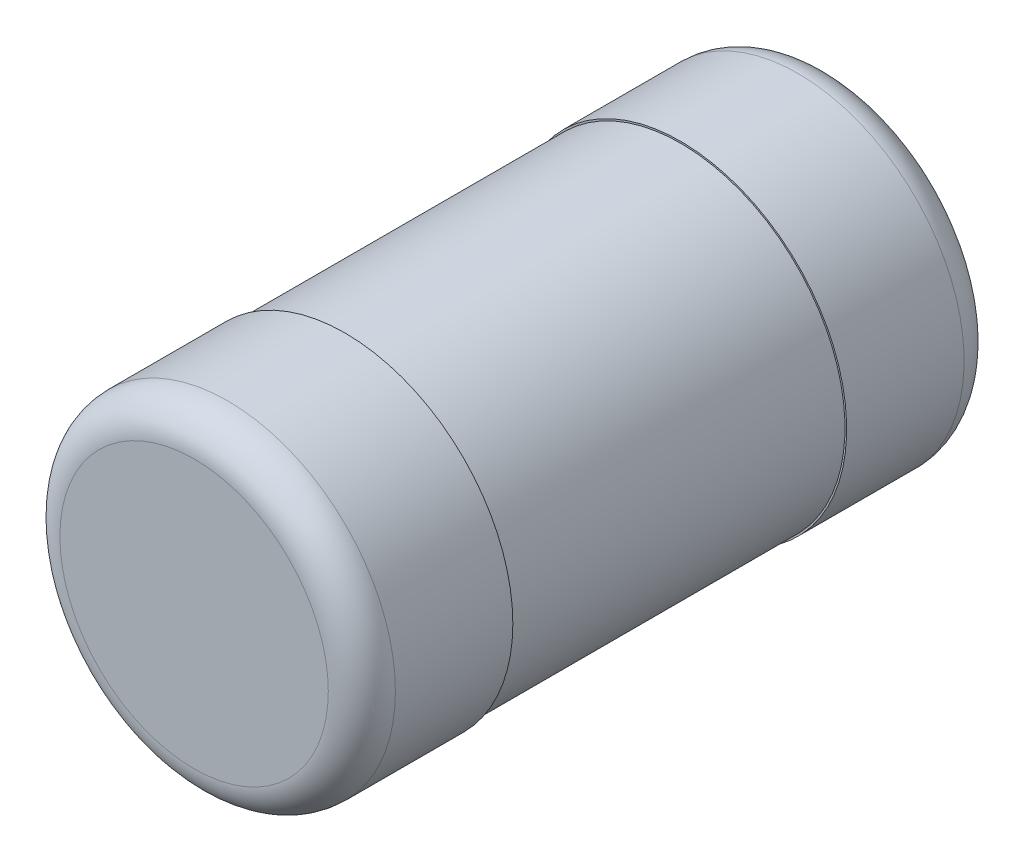
ISO-10303-21;
HEADER;
FILE_DESCRIPTION(('STEP AP214'),'2;1');
FILE_NAME('part.step','',(''),(''),'','','');
FILE_SCHEMA(('AUTOMOTIVE_DESIGN { 1 0 10303 214 1 1 1 1 }'));
ENDSEC;
DATA;
#1=APPLICATION_CONTEXT('core data for automotive mechanical design processes');
#2=APPLICATION_PROTOCOL_DEFINITION('international standard','automotive_design',2000,#1);
#3=PRODUCT_CONTEXT('',#1,'mechanical');
#4=PRODUCT('Part','Part','',(#3));
#5=PRODUCT_RELATED_PRODUCT_CATEGORY('part','',(#4));
#6=PRODUCT_DEFINITION_FORMATION('','',#4);
#7=PRODUCT_DEFINITION_CONTEXT('part definition',#1,'design');
#8=PRODUCT_DEFINITION('design','',#6,#7);
#9=PRODUCT_DEFINITION_SHAPE('','',#8);
#10=(LENGTH_UNIT() NAMED_UNIT(*) SI_UNIT(.MILLI.,.METRE.));
#11=(NAMED_UNIT(*) PLANE_ANGLE_UNIT() SI_UNIT($,.RADIAN.));
#12=(NAMED_UNIT(*) SI_UNIT($,.STERADIAN.) SOLID_ANGLE_UNIT());
#13=UNCERTAINTY_MEASURE_WITH_UNIT(LENGTH_MEASURE(1.E-05),#10,'distance_accuracy_value','');
#14=(GEOMETRIC_REPRESENTATION_CONTEXT(3) GLOBAL_UNCERTAINTY_ASSIGNED_CONTEXT((#13)) GLOBAL_UNIT_ASSIGNED_CONTEXT((#10,
#11,#12)) REPRESENTATION_CONTEXT('',''));
#15=CARTESIAN_POINT('',(0.,0.,0.));
#16=DIRECTION('',(0.,0.,1.));
#17=DIRECTION('',(1.,0.,0.));
#18=AXIS2_PLACEMENT_3D('',#15,#16,#17);
#19=CARTESIAN_POINT('',(0.,0.,5.));
#20=DIRECTION('',(0.,0.,-1.));
#21=DIRECTION('',(-1.,0.,0.));
#22=AXIS2_PLACEMENT_3D('',#19,#20,#21);
#23=CYLINDRICAL_SURFACE('',#22,2.45);
#24=CARTESIAN_POINT('',(0.,0.,5.));
#25=DIRECTION('',(0.,0.,1.));
#26=DIRECTION('',(1.,0.,0.));
#27=AXIS2_PLACEMENT_3D('',#24,#25,#26);
#28=CIRCLE('',#27,2.45);
#29=CARTESIAN_POINT('',(2.45,0.,5.));
#30=VERTEX_POINT('',#29);
#31=EDGE_CURVE('E51',#30,#30,#28,.T.);
#32=ORIENTED_EDGE('',*,*,#31,.F.);
#33=EDGE_LOOP('',(#32));
#34=FACE_BOUND('',#33,.T.);
#35=CARTESIAN_POINT('',(0.,0.,0.));
#36=DIRECTION('',(0.,0.,-1.));
#37=DIRECTION('',(-1.,0.,0.));
#38=AXIS2_PLACEMENT_3D('',#35,#36,#37);
#39=CIRCLE('',#38,2.45);
#40=CARTESIAN_POINT('',(-2.45,0.,0.));
#41=VERTEX_POINT('',#40);
#42=EDGE_CURVE('E57',#41,#41,#39,.T.);
#43=ORIENTED_EDGE('',*,*,#42,.F.);
#44=EDGE_LOOP('',(#43));
#45=FACE_BOUND('',#44,.T.);
#46=ADVANCED_FACE('F31',(#34,#45),#23,.T.);
#47=CARTESIAN_POINT('',(0.,0.,7.25));
#48=DIRECTION('',(0.,0.,-1.));
#49=DIRECTION('',(-1.,0.,0.));
#50=AXIS2_PLACEMENT_3D('',#47,#48,#49);
#51=CYLINDRICAL_SURFACE('',#50,2.5);
#52=CARTESIAN_POINT('',(0.,0.,6.75));
#53=DIRECTION('',(0.,0.,1.));
#54=DIRECTION('',(1.,0.,0.));
#55=AXIS2_PLACEMENT_3D('',#52,#53,#54);
#56=CIRCLE('',#55,2.5);
#57=CARTESIAN_POINT('',(2.5,0.,6.75));
#58=VERTEX_POINT('',#57);
#59=EDGE_CURVE('E42',#58,#58,#56,.F.);
#60=ORIENTED_EDGE('',*,*,#59,.T.);
#61=EDGE_LOOP('',(#60));
#62=FACE_BOUND('',#61,.T.);
#63=CARTESIAN_POINT('',(0.,0.,5.));
#64=DIRECTION('',(0.,0.,1.));
#65=DIRECTION('',(1.,0.,0.));
#66=AXIS2_PLACEMENT_3D('',#63,#64,#65);
#67=CIRCLE('',#66,2.5);
#68=CARTESIAN_POINT('',(2.5,0.,5.));
#69=VERTEX_POINT('',#68);
#70=EDGE_CURVE('E54',#69,#69,#67,.T.);
#71=ORIENTED_EDGE('',*,*,#70,.T.);
#72=EDGE_LOOP('',(#71));
#73=FACE_BOUND('',#72,.T.);
#74=ADVANCED_FACE('F80',(#62,#73),#51,.T.);
#75=CARTESIAN_POINT('',(0.,0.,7.25));
#76=DIRECTION('',(0.,0.,1.));
#77=DIRECTION('',(1.,0.,0.));
#78=AXIS2_PLACEMENT_3D('',#75,#76,#77);
#79=PLANE('',#78);
#80=CARTESIAN_POINT('',(0.,0.,7.25));
#81=DIRECTION('',(0.,0.,1.));
#82=DIRECTION('',(1.,0.,0.));
#83=AXIS2_PLACEMENT_3D('',#80,#81,#82);
#84=CIRCLE('',#83,2.);
#85=CARTESIAN_POINT('',(2.,0.,7.25));
#86=VERTEX_POINT('',#85);
#87=EDGE_CURVE('E46',#86,#86,#84,.T.);
#88=ORIENTED_EDGE('',*,*,#87,.T.);
#89=EDGE_LOOP('',(#88));
#90=FACE_BOUND('',#89,.T.);
#91=ADVANCED_FACE('F86',(#90),#79,.T.);
#92=CARTESIAN_POINT('',(0.,0.,5.));
#93=DIRECTION('',(0.,0.,1.));
#94=DIRECTION('',(1.,0.,0.));
#95=AXIS2_PLACEMENT_3D('',#92,#93,#94);
#96=PLANE('',#95);
#97=ORIENTED_EDGE('',*,*,#31,.T.);
#98=EDGE_LOOP('',(#97));
#99=FACE_BOUND('',#98,.T.);
#100=ORIENTED_EDGE('',*,*,#70,.F.);
#101=EDGE_LOOP('',(#100));
#102=FACE_BOUND('',#101,.T.);
#103=ADVANCED_FACE('F92',(#99,#102),#96,.F.);
#104=CARTESIAN_POINT('',(0.,0.,-2.25));
#105=DIRECTION('',(0.,0.,1.));
#106=DIRECTION('',(1.,0.,0.));
#107=AXIS2_PLACEMENT_3D('',#104,#105,#106);
#108=CYLINDRICAL_SURFACE('',#107,2.475);
#109=CARTESIAN_POINT('',(0.,0.,-1.75));
#110=DIRECTION('',(0.,0.,-1.));
#111=DIRECTION('',(-1.,0.,0.));
#112=AXIS2_PLACEMENT_3D('',#109,#110,#111);
#113=CIRCLE('',#112,2.475);
#114=CARTESIAN_POINT('',(-2.475,0.,-1.75));
#115=VERTEX_POINT('',#114);
#116=EDGE_CURVE('E10',#115,#115,#113,.F.);
#117=ORIENTED_EDGE('',*,*,#116,.T.);
#118=EDGE_LOOP('',(#117));
#119=FACE_BOUND('',#118,.T.);
#120=CARTESIAN_POINT('',(0.,0.,0.));
#121=DIRECTION('',(0.,0.,-1.));
#122=DIRECTION('',(-1.,0.,0.));
#123=AXIS2_PLACEMENT_3D('',#120,#121,#122);
#124=CIRCLE('',#123,2.475);
#125=CARTESIAN_POINT('',(-2.475,0.,0.));
#126=VERTEX_POINT('',#125);
#127=EDGE_CURVE('E60',#126,#126,#124,.T.);
#128=ORIENTED_EDGE('',*,*,#127,.T.);
#129=EDGE_LOOP('',(#128));
#130=FACE_BOUND('',#129,.T.);
#131=ADVANCED_FACE('F64',(#119,#130),#108,.T.);
#132=CARTESIAN_POINT('',(0.,0.,-2.25));
#133=DIRECTION('',(0.,0.,-1.));
#134=DIRECTION('',(-1.,0.,0.));
#135=AXIS2_PLACEMENT_3D('',#132,#133,#134);
#136=PLANE('',#135);
#137=CARTESIAN_POINT('',(0.,0.,-2.25));
#138=DIRECTION('',(0.,0.,-1.));
#139=DIRECTION('',(-1.,0.,0.));
#140=AXIS2_PLACEMENT_3D('',#137,#138,#139);
#141=CIRCLE('',#140,1.975);
#142=CARTESIAN_POINT('',(-1.975,0.,-2.25));
#143=VERTEX_POINT('',#142);
#144=EDGE_CURVE('E38',#143,#143,#141,.T.);
#145=ORIENTED_EDGE('',*,*,#144,.T.);
#146=EDGE_LOOP('',(#145));
#147=FACE_BOUND('',#146,.T.);
#148=ADVANCED_FACE('F69',(#147),#136,.T.);
#149=CARTESIAN_POINT('',(0.,0.,0.));
#150=DIRECTION('',(0.,0.,-1.));
#151=DIRECTION('',(-1.,0.,0.));
#152=AXIS2_PLACEMENT_3D('',#149,#150,#151);
#153=PLANE('',#152);
#154=ORIENTED_EDGE('',*,*,#42,.T.);
#155=EDGE_LOOP('',(#154));
#156=FACE_BOUND('',#155,.T.);
#157=ORIENTED_EDGE('',*,*,#127,.F.);
#158=EDGE_LOOP('',(#157));
#159=FACE_BOUND('',#158,.T.);
#160=ADVANCED_FACE('F66',(#156,#159),#153,.F.);
#161=CARTESIAN_POINT('',(0.,0.,6.75));
#162=DIRECTION('',(0.,0.,1.));
#163=DIRECTION('',(1.,0.,0.));
#164=AXIS2_PLACEMENT_3D('',#161,#162,#163);
#165=TOROIDAL_SURFACE('',#164,2.,0.5);
#166=ORIENTED_EDGE('',*,*,#59,.F.);
#167=EDGE_LOOP('',(#166));
#168=FACE_BOUND('',#167,.T.);
#169=ORIENTED_EDGE('',*,*,#87,.F.);
#170=EDGE_LOOP('',(#169));
#171=FACE_BOUND('',#170,.T.);
#172=ADVANCED_FACE('F68',(#168,#171),#165,.T.);
#173=CARTESIAN_POINT('',(0.,0.,-1.75));
#174=DIRECTION('',(0.,0.,-1.));
#175=DIRECTION('',(-1.,0.,0.));
#176=AXIS2_PLACEMENT_3D('',#173,#174,#175);
#177=TOROIDAL_SURFACE('',#176,1.975,0.5);
#178=ORIENTED_EDGE('',*,*,#116,.F.);
#179=EDGE_LOOP('',(#178));
#180=FACE_BOUND('',#179,.T.);
#181=ORIENTED_EDGE('',*,*,#144,.F.);
#182=EDGE_LOOP('',(#181));
#183=FACE_BOUND('',#182,.T.);
#184=ADVANCED_FACE('F33',(#180,#183),#177,.T.);
#185=CLOSED_SHELL('',(#46,#74,#91,#103,#131,#148,#160,#172,#184));
#186=MANIFOLD_SOLID_BREP('B2',#185);
#187=ADVANCED_BREP_SHAPE_REPRESENTATION('',(#18,#186),#14);
#188=SHAPE_DEFINITION_REPRESENTATION(#9,#187);
ENDSEC;
END-ISO-10303-21;
